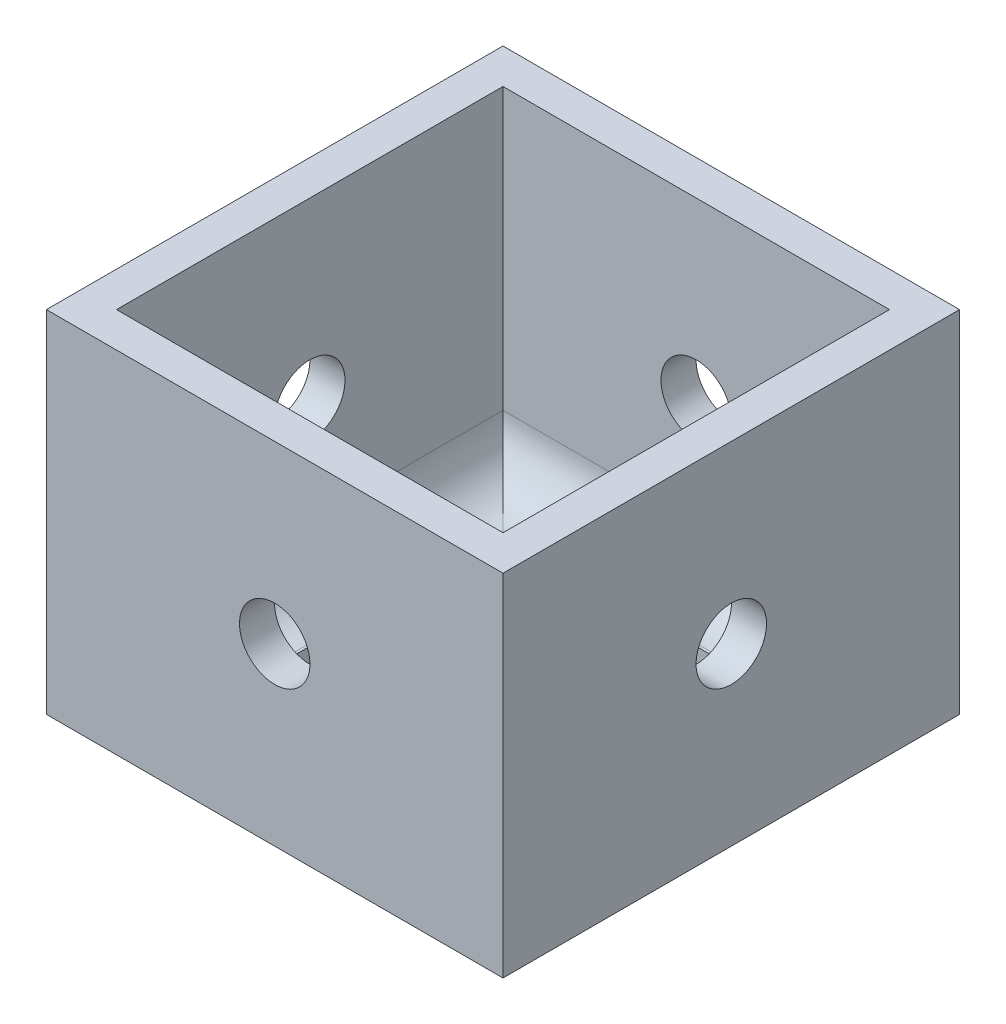
ISO-10303-21;
HEADER;
FILE_DESCRIPTION(('STEP AP214'),'2;1');
FILE_NAME('part.step','',(''),(''),'','','');
FILE_SCHEMA(('AUTOMOTIVE_DESIGN { 1 0 10303 214 1 1 1 1 }'));
ENDSEC;
DATA;
#1=APPLICATION_CONTEXT('core data for automotive mechanical design processes');
#2=APPLICATION_PROTOCOL_DEFINITION('international standard','automotive_design',2000,#1);
#3=PRODUCT_CONTEXT('',#1,'mechanical');
#4=PRODUCT('Part','Part','',(#3));
#5=PRODUCT_RELATED_PRODUCT_CATEGORY('part','',(#4));
#6=PRODUCT_DEFINITION_FORMATION('','',#4);
#7=PRODUCT_DEFINITION_CONTEXT('part definition',#1,'design');
#8=PRODUCT_DEFINITION('design','',#6,#7);
#9=PRODUCT_DEFINITION_SHAPE('','',#8);
#10=(LENGTH_UNIT() NAMED_UNIT(*) SI_UNIT(.MILLI.,.METRE.));
#11=(NAMED_UNIT(*) PLANE_ANGLE_UNIT() SI_UNIT($,.RADIAN.));
#12=(NAMED_UNIT(*) SI_UNIT($,.STERADIAN.) SOLID_ANGLE_UNIT());
#13=UNCERTAINTY_MEASURE_WITH_UNIT(LENGTH_MEASURE(1.E-05),#10,'distance_accuracy_value','');
#14=(GEOMETRIC_REPRESENTATION_CONTEXT(3) GLOBAL_UNCERTAINTY_ASSIGNED_CONTEXT((#13)) GLOBAL_UNIT_ASSIGNED_CONTEXT((#10,
#11,#12)) REPRESENTATION_CONTEXT('',''));
#15=CARTESIAN_POINT('',(0.,0.,0.));
#16=DIRECTION('',(0.,0.,1.));
#17=DIRECTION('',(1.,0.,0.));
#18=AXIS2_PLACEMENT_3D('',#15,#16,#17);
#19=CARTESIAN_POINT('',(0.,25.4,0.));
#20=DIRECTION('',(-1.,0.,0.));
#21=DIRECTION('',(0.,0.,1.));
#22=AXIS2_PLACEMENT_3D('',#19,#20,#21);
#23=PLANE('',#22);
#24=CARTESIAN_POINT('',(0.,12.7,-13.9999999999999));
#25=DIRECTION('',(-1.,0.,0.));
#26=DIRECTION('',(0.,0.,1.));
#27=AXIS2_PLACEMENT_3D('',#24,#25,#26);
#28=CIRCLE('',#27,2.55269999999999);
#29=CARTESIAN_POINT('',(0.,12.7,-11.4472999999999));
#30=VERTEX_POINT('',#29);
#31=EDGE_CURVE('E224',#30,#30,#28,.T.);
#32=ORIENTED_EDGE('',*,*,#31,.T.);
#33=EDGE_LOOP('',(#32));
#34=FACE_BOUND('',#33,.T.);
#35=DIRECTION('',(0.,-1.,0.));
#36=VECTOR('',#35,1.);
#37=CARTESIAN_POINT('',(0.,25.4,0.));
#38=LINE('',#37,#36);
#39=CARTESIAN_POINT('',(0.,25.4,0.));
#40=VERTEX_POINT('',#39);
#41=CARTESIAN_POINT('',(0.,5.08,0.));
#42=VERTEX_POINT('',#41);
#43=EDGE_CURVE('E265',#40,#42,#38,.T.);
#44=ORIENTED_EDGE('',*,*,#43,.T.);
#45=DIRECTION('',(0.,0.,1.));
#46=VECTOR('',#45,1.);
#47=CARTESIAN_POINT('',(0.,5.08,-28.));
#48=LINE('',#47,#46);
#49=CARTESIAN_POINT('',(0.,5.08,-28.));
#50=VERTEX_POINT('',#49);
#51=EDGE_CURVE('E339',#42,#50,#48,.F.);
#52=ORIENTED_EDGE('',*,*,#51,.T.);
#53=DIRECTION('',(0.,-1.,0.));
#54=VECTOR('',#53,1.);
#55=CARTESIAN_POINT('',(0.,25.4,-28.));
#56=LINE('',#55,#54);
#57=CARTESIAN_POINT('',(0.,25.4,-28.));
#58=VERTEX_POINT('',#57);
#59=EDGE_CURVE('E264',#58,#50,#56,.T.);
#60=ORIENTED_EDGE('',*,*,#59,.F.);
#61=DIRECTION('',(0.,0.,-1.));
#62=VECTOR('',#61,1.);
#63=CARTESIAN_POINT('',(0.,25.4,0.));
#64=LINE('',#63,#62);
#65=EDGE_CURVE('E249',#40,#58,#64,.T.);
#66=ORIENTED_EDGE('',*,*,#65,.F.);
#67=EDGE_LOOP('',(#44,#52,#60,#66));
#68=FACE_BOUND('',#67,.T.);
#69=ADVANCED_FACE('F63',(#34,#68),#23,.F.);
#70=CARTESIAN_POINT('',(0.,25.4,0.));
#71=DIRECTION('',(0.,0.,-1.));
#72=DIRECTION('',(-1.,0.,0.));
#73=AXIS2_PLACEMENT_3D('',#70,#71,#72);
#74=PLANE('',#73);
#75=CARTESIAN_POINT('',(14.,12.7,0.));
#76=DIRECTION('',(0.,0.,-1.));
#77=DIRECTION('',(-1.,0.,0.));
#78=AXIS2_PLACEMENT_3D('',#75,#76,#77);
#79=CIRCLE('',#78,2.55269999999999);
#80=CARTESIAN_POINT('',(11.4473,12.7,0.));
#81=VERTEX_POINT('',#80);
#82=EDGE_CURVE('E245',#81,#81,#79,.T.);
#83=ORIENTED_EDGE('',*,*,#82,.F.);
#84=EDGE_LOOP('',(#83));
#85=FACE_BOUND('',#84,.T.);
#86=DIRECTION('',(0.,-1.,0.));
#87=VECTOR('',#86,1.);
#88=CARTESIAN_POINT('',(28.,25.4,0.));
#89=LINE('',#88,#87);
#90=CARTESIAN_POINT('',(28.,25.4,0.));
#91=VERTEX_POINT('',#90);
#92=CARTESIAN_POINT('',(28.,5.08,0.));
#93=VERTEX_POINT('',#92);
#94=EDGE_CURVE('E269',#91,#93,#89,.T.);
#95=ORIENTED_EDGE('',*,*,#94,.T.);
#96=DIRECTION('',(1.,0.,0.));
#97=VECTOR('',#96,1.);
#98=CARTESIAN_POINT('',(0.,5.08,0.));
#99=LINE('',#98,#97);
#100=EDGE_CURVE('E73',#93,#42,#99,.F.);
#101=ORIENTED_EDGE('',*,*,#100,.T.);
#102=ORIENTED_EDGE('',*,*,#43,.F.);
#103=DIRECTION('',(1.,0.,0.));
#104=VECTOR('',#103,1.);
#105=CARTESIAN_POINT('',(0.,25.4,0.));
#106=LINE('',#105,#104);
#107=EDGE_CURVE('E261',#40,#91,#106,.T.);
#108=ORIENTED_EDGE('',*,*,#107,.T.);
#109=EDGE_LOOP('',(#95,#101,#102,#108));
#110=FACE_BOUND('',#109,.T.);
#111=ADVANCED_FACE('F389',(#85,#110),#74,.T.);
#112=CARTESIAN_POINT('',(28.,25.4,0.));
#113=DIRECTION('',(-1.,0.,0.));
#114=DIRECTION('',(0.,0.,1.));
#115=AXIS2_PLACEMENT_3D('',#112,#113,#114);
#116=PLANE('',#115);
#117=CARTESIAN_POINT('',(28.,12.7,-14.));
#118=DIRECTION('',(-1.,0.,0.));
#119=DIRECTION('',(0.,0.,1.));
#120=AXIS2_PLACEMENT_3D('',#117,#118,#119);
#121=CIRCLE('',#120,2.55269999999999);
#122=CARTESIAN_POINT('',(28.,12.7,-11.4473000000001));
#123=VERTEX_POINT('',#122);
#124=EDGE_CURVE('E237',#123,#123,#121,.T.);
#125=ORIENTED_EDGE('',*,*,#124,.F.);
#126=EDGE_LOOP('',(#125));
#127=FACE_BOUND('',#126,.T.);
#128=DIRECTION('',(0.,-1.,0.));
#129=VECTOR('',#128,1.);
#130=CARTESIAN_POINT('',(28.,25.4,-28.));
#131=LINE('',#130,#129);
#132=CARTESIAN_POINT('',(28.,25.4,-28.));
#133=VERTEX_POINT('',#132);
#134=CARTESIAN_POINT('',(28.,5.08,-28.));
#135=VERTEX_POINT('',#134);
#136=EDGE_CURVE('E272',#133,#135,#131,.T.);
#137=ORIENTED_EDGE('',*,*,#136,.T.);
#138=DIRECTION('',(0.,0.,-1.));
#139=VECTOR('',#138,1.);
#140=CARTESIAN_POINT('',(28.,5.08,0.));
#141=LINE('',#140,#139);
#142=EDGE_CURVE('E12',#135,#93,#141,.F.);
#143=ORIENTED_EDGE('',*,*,#142,.T.);
#144=ORIENTED_EDGE('',*,*,#94,.F.);
#145=DIRECTION('',(0.,0.,-1.));
#146=VECTOR('',#145,1.);
#147=CARTESIAN_POINT('',(28.,25.4,0.));
#148=LINE('',#147,#146);
#149=EDGE_CURVE('E257',#91,#133,#148,.T.);
#150=ORIENTED_EDGE('',*,*,#149,.T.);
#151=EDGE_LOOP('',(#137,#143,#144,#150));
#152=FACE_BOUND('',#151,.T.);
#153=ADVANCED_FACE('F395',(#127,#152),#116,.T.);
#154=CARTESIAN_POINT('',(0.,25.4,-28.));
#155=DIRECTION('',(0.,0.,-1.));
#156=DIRECTION('',(-1.,0.,0.));
#157=AXIS2_PLACEMENT_3D('',#154,#155,#156);
#158=PLANE('',#157);
#159=CARTESIAN_POINT('',(14.,12.7,-28.));
#160=DIRECTION('',(0.,0.,-1.));
#161=DIRECTION('',(-1.,0.,0.));
#162=AXIS2_PLACEMENT_3D('',#159,#160,#161);
#163=CIRCLE('',#162,2.55269999999999);
#164=CARTESIAN_POINT('',(11.4473,12.7,-28.));
#165=VERTEX_POINT('',#164);
#166=EDGE_CURVE('E232',#165,#165,#163,.T.);
#167=ORIENTED_EDGE('',*,*,#166,.T.);
#168=EDGE_LOOP('',(#167));
#169=FACE_BOUND('',#168,.T.);
#170=ORIENTED_EDGE('',*,*,#59,.T.);
#171=DIRECTION('',(-1.,0.,0.));
#172=VECTOR('',#171,1.);
#173=CARTESIAN_POINT('',(28.,5.08,-28.));
#174=LINE('',#173,#172);
#175=EDGE_CURVE('E335',#50,#135,#174,.F.);
#176=ORIENTED_EDGE('',*,*,#175,.T.);
#177=ORIENTED_EDGE('',*,*,#136,.F.);
#178=DIRECTION('',(1.,0.,0.));
#179=VECTOR('',#178,1.);
#180=CARTESIAN_POINT('',(0.,25.4,-28.));
#181=LINE('',#180,#179);
#182=EDGE_CURVE('E253',#58,#133,#181,.T.);
#183=ORIENTED_EDGE('',*,*,#182,.F.);
#184=EDGE_LOOP('',(#170,#176,#177,#183));
#185=FACE_BOUND('',#184,.T.);
#186=ADVANCED_FACE('F372',(#169,#185),#158,.F.);
#187=CARTESIAN_POINT('',(-2.54,25.4,0.));
#188=DIRECTION('',(-1.,0.,0.));
#189=DIRECTION('',(0.,0.,1.));
#190=AXIS2_PLACEMENT_3D('',#187,#188,#189);
#191=PLANE('',#190);
#192=CARTESIAN_POINT('',(-2.54,12.7,-13.9999999999998));
#193=DIRECTION('',(-1.,0.,0.));
#194=DIRECTION('',(0.,0.,1.));
#195=AXIS2_PLACEMENT_3D('',#192,#193,#194);
#196=CIRCLE('',#195,2.55269999999999);
#197=CARTESIAN_POINT('',(-2.53999999999998,12.7,-11.4472999999998));
#198=VERTEX_POINT('',#197);
#199=EDGE_CURVE('E187',#198,#198,#196,.T.);
#200=ORIENTED_EDGE('',*,*,#199,.F.);
#201=EDGE_LOOP('',(#200));
#202=FACE_BOUND('',#201,.T.);
#203=DIRECTION('',(0.,0.,-1.));
#204=VECTOR('',#203,1.);
#205=CARTESIAN_POINT('',(-2.54,0.,0.));
#206=LINE('',#205,#204);
#207=CARTESIAN_POINT('',(-2.54,0.,2.54));
#208=VERTEX_POINT('',#207);
#209=CARTESIAN_POINT('',(-2.54,0.,-30.54));
#210=VERTEX_POINT('',#209);
#211=EDGE_CURVE('E268',#208,#210,#206,.T.);
#212=ORIENTED_EDGE('',*,*,#211,.F.);
#213=DIRECTION('',(0.,-1.,0.));
#214=VECTOR('',#213,1.);
#215=CARTESIAN_POINT('',(-2.54,25.4,2.54));
#216=LINE('',#215,#214);
#217=CARTESIAN_POINT('',(-2.54,25.4,2.54));
#218=VERTEX_POINT('',#217);
#219=EDGE_CURVE('E307',#218,#208,#216,.T.);
#220=ORIENTED_EDGE('',*,*,#219,.F.);
#221=DIRECTION('',(0.,0.,-1.));
#222=VECTOR('',#221,1.);
#223=CARTESIAN_POINT('',(-2.54,25.4,0.));
#224=LINE('',#223,#222);
#225=CARTESIAN_POINT('',(-2.54,25.4,-30.54));
#226=VERTEX_POINT('',#225);
#227=EDGE_CURVE('E278',#218,#226,#224,.T.);
#228=ORIENTED_EDGE('',*,*,#227,.T.);
#229=DIRECTION('',(0.,-1.,0.));
#230=VECTOR('',#229,1.);
#231=CARTESIAN_POINT('',(-2.54,25.4,-30.54));
#232=LINE('',#231,#230);
#233=EDGE_CURVE('E293',#226,#210,#232,.T.);
#234=ORIENTED_EDGE('',*,*,#233,.T.);
#235=EDGE_LOOP('',(#212,#220,#228,#234));
#236=FACE_BOUND('',#235,.T.);
#237=ADVANCED_FACE('F415',(#202,#236),#191,.T.);
#238=CARTESIAN_POINT('',(0.,25.4,2.54));
#239=DIRECTION('',(0.,0.,-1.));
#240=DIRECTION('',(-1.,0.,0.));
#241=AXIS2_PLACEMENT_3D('',#238,#239,#240);
#242=PLANE('',#241);
#243=CARTESIAN_POINT('',(14.,12.7,2.54));
#244=DIRECTION('',(0.,0.,1.));
#245=DIRECTION('',(1.,0.,0.));
#246=AXIS2_PLACEMENT_3D('',#243,#244,#245);
#247=CIRCLE('',#246,2.55269999999999);
#248=CARTESIAN_POINT('',(16.5527,12.7,2.54));
#249=VERTEX_POINT('',#248);
#250=EDGE_CURVE('E241',#249,#249,#247,.T.);
#251=ORIENTED_EDGE('',*,*,#250,.F.);
#252=EDGE_LOOP('',(#251));
#253=FACE_BOUND('',#252,.T.);
#254=DIRECTION('',(1.,0.,0.));
#255=VECTOR('',#254,1.);
#256=CARTESIAN_POINT('',(0.,0.,2.54));
#257=LINE('',#256,#255);
#258=CARTESIAN_POINT('',(30.54,0.,2.54));
#259=VERTEX_POINT('',#258);
#260=EDGE_CURVE('E283',#208,#259,#257,.T.);
#261=ORIENTED_EDGE('',*,*,#260,.T.);
#262=DIRECTION('',(0.,-1.,0.));
#263=VECTOR('',#262,1.);
#264=CARTESIAN_POINT('',(30.54,25.4,2.54));
#265=LINE('',#264,#263);
#266=CARTESIAN_POINT('',(30.54,25.4,2.54));
#267=VERTEX_POINT('',#266);
#268=EDGE_CURVE('E311',#267,#259,#265,.T.);
#269=ORIENTED_EDGE('',*,*,#268,.F.);
#270=DIRECTION('',(1.,0.,0.));
#271=VECTOR('',#270,1.);
#272=CARTESIAN_POINT('',(0.,25.4,2.54));
#273=LINE('',#272,#271);
#274=EDGE_CURVE('E290',#218,#267,#273,.T.);
#275=ORIENTED_EDGE('',*,*,#274,.F.);
#276=ORIENTED_EDGE('',*,*,#219,.T.);
#277=EDGE_LOOP('',(#261,#269,#275,#276));
#278=FACE_BOUND('',#277,.T.);
#279=ADVANCED_FACE('F411',(#253,#278),#242,.F.);
#280=CARTESIAN_POINT('',(30.54,25.4,0.));
#281=DIRECTION('',(-1.,0.,0.));
#282=DIRECTION('',(0.,0.,1.));
#283=AXIS2_PLACEMENT_3D('',#280,#281,#282);
#284=PLANE('',#283);
#285=CARTESIAN_POINT('',(30.54,12.7,-14.0000000000001));
#286=DIRECTION('',(1.,0.,0.));
#287=DIRECTION('',(0.,0.,-1.));
#288=AXIS2_PLACEMENT_3D('',#285,#286,#287);
#289=CIRCLE('',#288,2.55269999999999);
#290=CARTESIAN_POINT('',(30.54,12.7,-16.5527));
#291=VERTEX_POINT('',#290);
#292=EDGE_CURVE('E233',#291,#291,#289,.T.);
#293=ORIENTED_EDGE('',*,*,#292,.F.);
#294=EDGE_LOOP('',(#293));
#295=FACE_BOUND('',#294,.T.);
#296=DIRECTION('',(0.,0.,-1.));
#297=VECTOR('',#296,1.);
#298=CARTESIAN_POINT('',(30.54,0.,0.));
#299=LINE('',#298,#297);
#300=CARTESIAN_POINT('',(30.54,0.,-30.54));
#301=VERTEX_POINT('',#300);
#302=EDGE_CURVE('E301',#259,#301,#299,.T.);
#303=ORIENTED_EDGE('',*,*,#302,.T.);
#304=DIRECTION('',(0.,-1.,0.));
#305=VECTOR('',#304,1.);
#306=CARTESIAN_POINT('',(30.54,25.4,-30.54));
#307=LINE('',#306,#305);
#308=CARTESIAN_POINT('',(30.54,25.4,-30.54));
#309=VERTEX_POINT('',#308);
#310=EDGE_CURVE('E315',#309,#301,#307,.T.);
#311=ORIENTED_EDGE('',*,*,#310,.F.);
#312=DIRECTION('',(0.,0.,-1.));
#313=VECTOR('',#312,1.);
#314=CARTESIAN_POINT('',(30.54,25.4,0.));
#315=LINE('',#314,#313);
#316=EDGE_CURVE('E287',#267,#309,#315,.T.);
#317=ORIENTED_EDGE('',*,*,#316,.F.);
#318=ORIENTED_EDGE('',*,*,#268,.T.);
#319=EDGE_LOOP('',(#303,#311,#317,#318));
#320=FACE_BOUND('',#319,.T.);
#321=ADVANCED_FACE('F414',(#295,#320),#284,.F.);
#322=CARTESIAN_POINT('',(0.,25.4,-30.54));
#323=DIRECTION('',(0.,0.,-1.));
#324=DIRECTION('',(-1.,0.,0.));
#325=AXIS2_PLACEMENT_3D('',#322,#323,#324);
#326=PLANE('',#325);
#327=CARTESIAN_POINT('',(14.,12.7,-30.54));
#328=DIRECTION('',(0.,0.,-1.));
#329=DIRECTION('',(-1.,0.,0.));
#330=AXIS2_PLACEMENT_3D('',#327,#328,#329);
#331=CIRCLE('',#330,2.55269999999999);
#332=CARTESIAN_POINT('',(11.4473,12.7,-30.54));
#333=VERTEX_POINT('',#332);
#334=EDGE_CURVE('E228',#333,#333,#331,.T.);
#335=ORIENTED_EDGE('',*,*,#334,.F.);
#336=EDGE_LOOP('',(#335));
#337=FACE_BOUND('',#336,.T.);
#338=DIRECTION('',(1.,0.,0.));
#339=VECTOR('',#338,1.);
#340=CARTESIAN_POINT('',(0.,0.,-30.54));
#341=LINE('',#340,#339);
#342=EDGE_CURVE('E297',#210,#301,#341,.T.);
#343=ORIENTED_EDGE('',*,*,#342,.F.);
#344=ORIENTED_EDGE('',*,*,#233,.F.);
#345=DIRECTION('',(1.,0.,0.));
#346=VECTOR('',#345,1.);
#347=CARTESIAN_POINT('',(0.,25.4,-30.54));
#348=LINE('',#347,#346);
#349=EDGE_CURVE('E282',#226,#309,#348,.T.);
#350=ORIENTED_EDGE('',*,*,#349,.T.);
#351=ORIENTED_EDGE('',*,*,#310,.T.);
#352=EDGE_LOOP('',(#343,#344,#350,#351));
#353=FACE_BOUND('',#352,.T.);
#354=ADVANCED_FACE('F405',(#337,#353),#326,.T.);
#355=CARTESIAN_POINT('',(0.,25.4,0.));
#356=DIRECTION('',(0.,-1.,0.));
#357=DIRECTION('',(0.,0.,-1.));
#358=AXIS2_PLACEMENT_3D('',#355,#356,#357);
#359=PLANE('',#358);
#360=ORIENTED_EDGE('',*,*,#107,.F.);
#361=ORIENTED_EDGE('',*,*,#65,.T.);
#362=ORIENTED_EDGE('',*,*,#182,.T.);
#363=ORIENTED_EDGE('',*,*,#149,.F.);
#364=EDGE_LOOP('',(#360,#361,#362,#363));
#365=FACE_BOUND('',#364,.T.);
#366=ORIENTED_EDGE('',*,*,#227,.F.);
#367=ORIENTED_EDGE('',*,*,#274,.T.);
#368=ORIENTED_EDGE('',*,*,#316,.T.);
#369=ORIENTED_EDGE('',*,*,#349,.F.);
#370=EDGE_LOOP('',(#366,#367,#368,#369));
#371=FACE_BOUND('',#370,.T.);
#372=ADVANCED_FACE('F401',(#365,#371),#359,.F.);
#373=CARTESIAN_POINT('',(0.,0.,0.));
#374=DIRECTION('',(0.,-1.,0.));
#375=DIRECTION('',(0.,0.,-1.));
#376=AXIS2_PLACEMENT_3D('',#373,#374,#375);
#377=PLANE('',#376);
#378=ORIENTED_EDGE('',*,*,#211,.T.);
#379=ORIENTED_EDGE('',*,*,#342,.T.);
#380=ORIENTED_EDGE('',*,*,#302,.F.);
#381=ORIENTED_EDGE('',*,*,#260,.F.);
#382=EDGE_LOOP('',(#378,#379,#380,#381));
#383=FACE_BOUND('',#382,.T.);
#384=DIRECTION('',(-1.,0.,0.));
#385=VECTOR('',#384,1.);
#386=CARTESIAN_POINT('',(4.,0.,-24.));
#387=LINE('',#386,#385);
#388=CARTESIAN_POINT('',(24.,0.,-24.));
#389=VERTEX_POINT('',#388);
#390=CARTESIAN_POINT('',(4.,0.,-24.));
#391=VERTEX_POINT('',#390);
#392=EDGE_CURVE('E179',#389,#391,#387,.T.);
#393=ORIENTED_EDGE('',*,*,#392,.T.);
#394=DIRECTION('',(0.,0.,1.));
#395=VECTOR('',#394,1.);
#396=CARTESIAN_POINT('',(4.,0.,-4.));
#397=LINE('',#396,#395);
#398=CARTESIAN_POINT('',(4.,0.,-4.));
#399=VERTEX_POINT('',#398);
#400=EDGE_CURVE('E202',#391,#399,#397,.T.);
#401=ORIENTED_EDGE('',*,*,#400,.T.);
#402=DIRECTION('',(1.,0.,0.));
#403=VECTOR('',#402,1.);
#404=CARTESIAN_POINT('',(4.,0.,-4.));
#405=LINE('',#404,#403);
#406=CARTESIAN_POINT('',(24.,0.,-4.));
#407=VERTEX_POINT('',#406);
#408=EDGE_CURVE('E185',#399,#407,#405,.T.);
#409=ORIENTED_EDGE('',*,*,#408,.T.);
#410=DIRECTION('',(0.,0.,-1.));
#411=VECTOR('',#410,1.);
#412=CARTESIAN_POINT('',(24.,0.,-4.));
#413=LINE('',#412,#411);
#414=EDGE_CURVE('E207',#407,#389,#413,.T.);
#415=ORIENTED_EDGE('',*,*,#414,.T.);
#416=EDGE_LOOP('',(#393,#401,#409,#415));
#417=FACE_BOUND('',#416,.T.);
#418=ADVANCED_FACE('F404',(#383,#417),#377,.T.);
#419=CARTESIAN_POINT('',(14.,12.7,2.54));
#420=DIRECTION('',(0.,0.,1.));
#421=DIRECTION('',(1.,0.,0.));
#422=AXIS2_PLACEMENT_3D('',#419,#420,#421);
#423=CYLINDRICAL_SURFACE('',#422,2.55269999999999);
#424=ORIENTED_EDGE('',*,*,#82,.T.);
#425=EDGE_LOOP('',(#424));
#426=FACE_BOUND('',#425,.T.);
#427=ORIENTED_EDGE('',*,*,#250,.T.);
#428=EDGE_LOOP('',(#427));
#429=FACE_BOUND('',#428,.T.);
#430=ADVANCED_FACE('F409',(#426,#429),#423,.F.);
#431=CARTESIAN_POINT('',(30.54,12.7,-14.0000000000001));
#432=DIRECTION('',(1.,0.,0.));
#433=DIRECTION('',(0.,0.,-1.));
#434=AXIS2_PLACEMENT_3D('',#431,#432,#433);
#435=CYLINDRICAL_SURFACE('',#434,2.55269999999999);
#436=ORIENTED_EDGE('',*,*,#124,.T.);
#437=EDGE_LOOP('',(#436));
#438=FACE_BOUND('',#437,.T.);
#439=ORIENTED_EDGE('',*,*,#292,.T.);
#440=EDGE_LOOP('',(#439));
#441=FACE_BOUND('',#440,.T.);
#442=ADVANCED_FACE('F539',(#438,#441),#435,.F.);
#443=CARTESIAN_POINT('',(14.,12.7,-30.54));
#444=DIRECTION('',(0.,0.,-1.));
#445=DIRECTION('',(-1.,0.,0.));
#446=AXIS2_PLACEMENT_3D('',#443,#444,#445);
#447=CYLINDRICAL_SURFACE('',#446,2.55269999999999);
#448=ORIENTED_EDGE('',*,*,#334,.T.);
#449=EDGE_LOOP('',(#448));
#450=FACE_BOUND('',#449,.T.);
#451=ORIENTED_EDGE('',*,*,#166,.F.);
#452=EDGE_LOOP('',(#451));
#453=FACE_BOUND('',#452,.T.);
#454=ADVANCED_FACE('F385',(#450,#453),#447,.F.);
#455=CARTESIAN_POINT('',(-2.54,12.7,-13.9999999999998));
#456=DIRECTION('',(-1.,0.,0.));
#457=DIRECTION('',(0.,0.,1.));
#458=AXIS2_PLACEMENT_3D('',#455,#456,#457);
#459=CYLINDRICAL_SURFACE('',#458,2.55269999999999);
#460=ORIENTED_EDGE('',*,*,#199,.T.);
#461=EDGE_LOOP('',(#460));
#462=FACE_BOUND('',#461,.T.);
#463=ORIENTED_EDGE('',*,*,#31,.F.);
#464=EDGE_LOOP('',(#463));
#465=FACE_BOUND('',#464,.T.);
#466=ADVANCED_FACE('F378',(#462,#465),#459,.F.);
#467=CARTESIAN_POINT('',(0.,1.27,0.));
#468=DIRECTION('',(0.,-1.,0.));
#469=DIRECTION('',(0.,0.,-1.));
#470=AXIS2_PLACEMENT_3D('',#467,#468,#469);
#471=PLANE('',#470);
#472=DIRECTION('',(0.,0.,-1.));
#473=VECTOR('',#472,1.);
#474=CARTESIAN_POINT('',(24.19,1.27,0.));
#475=LINE('',#474,#473);
#476=CARTESIAN_POINT('',(24.19,1.27,-3.81));
#477=VERTEX_POINT('',#476);
#478=CARTESIAN_POINT('',(24.19,1.27,-24.19));
#479=VERTEX_POINT('',#478);
#480=EDGE_CURVE('E310',#477,#479,#475,.T.);
#481=ORIENTED_EDGE('',*,*,#480,.T.);
#482=DIRECTION('',(-1.,0.,0.));
#483=VECTOR('',#482,1.);
#484=CARTESIAN_POINT('',(0.,1.27,-24.19));
#485=LINE('',#484,#483);
#486=CARTESIAN_POINT('',(3.81,1.27,-24.19));
#487=VERTEX_POINT('',#486);
#488=EDGE_CURVE('E331',#479,#487,#485,.T.);
#489=ORIENTED_EDGE('',*,*,#488,.T.);
#490=DIRECTION('',(0.,0.,1.));
#491=VECTOR('',#490,1.);
#492=CARTESIAN_POINT('',(3.81,1.27,0.));
#493=LINE('',#492,#491);
#494=CARTESIAN_POINT('',(3.81,1.27,-3.81));
#495=VERTEX_POINT('',#494);
#496=EDGE_CURVE('E328',#487,#495,#493,.T.);
#497=ORIENTED_EDGE('',*,*,#496,.T.);
#498=DIRECTION('',(1.,0.,0.));
#499=VECTOR('',#498,1.);
#500=CARTESIAN_POINT('',(0.,1.27,-3.81));
#501=LINE('',#500,#499);
#502=EDGE_CURVE('E325',#495,#477,#501,.T.);
#503=ORIENTED_EDGE('',*,*,#502,.T.);
#504=EDGE_LOOP('',(#481,#489,#497,#503));
#505=FACE_BOUND('',#504,.T.);
#506=DIRECTION('',(0.,0.,1.));
#507=VECTOR('',#506,1.);
#508=CARTESIAN_POINT('',(4.,1.27,-4.));
#509=LINE('',#508,#507);
#510=CARTESIAN_POINT('',(4.,1.27,-24.));
#511=VERTEX_POINT('',#510);
#512=CARTESIAN_POINT('',(4.,1.27,-4.));
#513=VERTEX_POINT('',#512);
#514=EDGE_CURVE('E167',#511,#513,#509,.T.);
#515=ORIENTED_EDGE('',*,*,#514,.F.);
#516=DIRECTION('',(-1.,0.,0.));
#517=VECTOR('',#516,1.);
#518=CARTESIAN_POINT('',(4.,1.27,-24.));
#519=LINE('',#518,#517);
#520=CARTESIAN_POINT('',(24.,1.27,-24.));
#521=VERTEX_POINT('',#520);
#522=EDGE_CURVE('E197',#521,#511,#519,.T.);
#523=ORIENTED_EDGE('',*,*,#522,.F.);
#524=DIRECTION('',(0.,0.,-1.));
#525=VECTOR('',#524,1.);
#526=CARTESIAN_POINT('',(24.,1.27,-4.));
#527=LINE('',#526,#525);
#528=CARTESIAN_POINT('',(24.,1.27,-4.));
#529=VERTEX_POINT('',#528);
#530=EDGE_CURVE('E193',#529,#521,#527,.T.);
#531=ORIENTED_EDGE('',*,*,#530,.F.);
#532=DIRECTION('',(1.,0.,0.));
#533=VECTOR('',#532,1.);
#534=CARTESIAN_POINT('',(4.,1.27,-4.));
#535=LINE('',#534,#533);
#536=EDGE_CURVE('E178',#513,#529,#535,.T.);
#537=ORIENTED_EDGE('',*,*,#536,.F.);
#538=EDGE_LOOP('',(#515,#523,#531,#537));
#539=FACE_BOUND('',#538,.T.);
#540=ADVANCED_FACE('F191',(#505,#539),#471,.F.);
#541=CARTESIAN_POINT('',(4.,1.27,-4.));
#542=DIRECTION('',(1.,0.,0.));
#543=DIRECTION('',(0.,0.,-1.));
#544=AXIS2_PLACEMENT_3D('',#541,#542,#543);
#545=PLANE('',#544);
#546=ORIENTED_EDGE('',*,*,#400,.F.);
#547=DIRECTION('',(0.,-1.,0.));
#548=VECTOR('',#547,1.);
#549=CARTESIAN_POINT('',(4.,1.27,-24.));
#550=LINE('',#549,#548);
#551=EDGE_CURVE('E173',#511,#391,#550,.T.);
#552=ORIENTED_EDGE('',*,*,#551,.F.);
#553=ORIENTED_EDGE('',*,*,#514,.T.);
#554=DIRECTION('',(0.,-1.,0.));
#555=VECTOR('',#554,1.);
#556=CARTESIAN_POINT('',(4.,1.27,-4.));
#557=LINE('',#556,#555);
#558=EDGE_CURVE('E170',#513,#399,#557,.T.);
#559=ORIENTED_EDGE('',*,*,#558,.T.);
#560=EDGE_LOOP('',(#546,#552,#553,#559));
#561=FACE_BOUND('',#560,.T.);
#562=ADVANCED_FACE('F169',(#561),#545,.T.);
#563=CARTESIAN_POINT('',(4.,1.27,-4.));
#564=DIRECTION('',(0.,0.,-1.));
#565=DIRECTION('',(-1.,0.,0.));
#566=AXIS2_PLACEMENT_3D('',#563,#564,#565);
#567=PLANE('',#566);
#568=ORIENTED_EDGE('',*,*,#408,.F.);
#569=ORIENTED_EDGE('',*,*,#558,.F.);
#570=ORIENTED_EDGE('',*,*,#536,.T.);
#571=DIRECTION('',(0.,-1.,0.));
#572=VECTOR('',#571,1.);
#573=CARTESIAN_POINT('',(24.,1.27,-4.));
#574=LINE('',#573,#572);
#575=EDGE_CURVE('E188',#529,#407,#574,.T.);
#576=ORIENTED_EDGE('',*,*,#575,.T.);
#577=EDGE_LOOP('',(#568,#569,#570,#576));
#578=FACE_BOUND('',#577,.T.);
#579=ADVANCED_FACE('F182',(#578),#567,.T.);
#580=CARTESIAN_POINT('',(24.,1.27,-4.));
#581=DIRECTION('',(-1.,0.,0.));
#582=DIRECTION('',(0.,0.,1.));
#583=AXIS2_PLACEMENT_3D('',#580,#581,#582);
#584=PLANE('',#583);
#585=ORIENTED_EDGE('',*,*,#414,.F.);
#586=ORIENTED_EDGE('',*,*,#575,.F.);
#587=ORIENTED_EDGE('',*,*,#530,.T.);
#588=DIRECTION('',(0.,-1.,0.));
#589=VECTOR('',#588,1.);
#590=CARTESIAN_POINT('',(24.,1.27,-24.));
#591=LINE('',#590,#589);
#592=EDGE_CURVE('E216',#521,#389,#591,.T.);
#593=ORIENTED_EDGE('',*,*,#592,.T.);
#594=EDGE_LOOP('',(#585,#586,#587,#593));
#595=FACE_BOUND('',#594,.T.);
#596=ADVANCED_FACE('F437',(#595),#584,.T.);
#597=CARTESIAN_POINT('',(4.,1.27,-24.));
#598=DIRECTION('',(0.,0.,1.));
#599=DIRECTION('',(1.,0.,0.));
#600=AXIS2_PLACEMENT_3D('',#597,#598,#599);
#601=PLANE('',#600);
#602=ORIENTED_EDGE('',*,*,#392,.F.);
#603=ORIENTED_EDGE('',*,*,#592,.F.);
#604=ORIENTED_EDGE('',*,*,#522,.T.);
#605=ORIENTED_EDGE('',*,*,#551,.T.);
#606=EDGE_LOOP('',(#602,#603,#604,#605));
#607=FACE_BOUND('',#606,.T.);
#608=ADVANCED_FACE('F433',(#607),#601,.T.);
#609=CARTESIAN_POINT('',(0.,5.08,-3.81));
#610=DIRECTION('',(1.,0.,0.));
#611=DIRECTION('',(0.,0.,-1.));
#612=AXIS2_PLACEMENT_3D('',#609,#610,#611);
#613=CYLINDRICAL_SURFACE('',#612,3.81);
#614=CARTESIAN_POINT('',(3.81,5.08,-3.81));
#615=DIRECTION('',(-0.707106781186547,0.,-0.707106781186547));
#616=DIRECTION('',(0.707106781186547,0.,-0.707106781186547));
#617=AXIS2_PLACEMENT_3D('',#614,#615,#616);
#618=ELLIPSE('',#617,5.38815367264149,3.81);
#619=EDGE_CURVE('E349',#42,#495,#618,.F.);
#620=ORIENTED_EDGE('',*,*,#619,.F.);
#621=ORIENTED_EDGE('',*,*,#100,.F.);
#622=CARTESIAN_POINT('',(24.19,5.08,-3.81));
#623=DIRECTION('',(0.707106781186547,0.,-0.707106781186547));
#624=DIRECTION('',(0.707106781186547,0.,0.707106781186547));
#625=AXIS2_PLACEMENT_3D('',#622,#623,#624);
#626=ELLIPSE('',#625,5.38815367264149,3.81);
#627=EDGE_CURVE('E67',#477,#93,#626,.F.);
#628=ORIENTED_EDGE('',*,*,#627,.F.);
#629=ORIENTED_EDGE('',*,*,#502,.F.);
#630=EDGE_LOOP('',(#620,#621,#628,#629));
#631=FACE_BOUND('',#630,.T.);
#632=ADVANCED_FACE('F65',(#631),#613,.F.);
#633=CARTESIAN_POINT('',(24.19,5.08,0.));
#634=DIRECTION('',(0.,0.,-1.));
#635=DIRECTION('',(-1.,0.,0.));
#636=AXIS2_PLACEMENT_3D('',#633,#634,#635);
#637=CYLINDRICAL_SURFACE('',#636,3.81);
#638=ORIENTED_EDGE('',*,*,#627,.T.);
#639=ORIENTED_EDGE('',*,*,#142,.F.);
#640=CARTESIAN_POINT('',(24.19,5.08,-24.19));
#641=DIRECTION('',(0.707106781186547,0.,0.707106781186547));
#642=DIRECTION('',(0.707106781186547,0.,-0.707106781186547));
#643=AXIS2_PLACEMENT_3D('',#640,#641,#642);
#644=ELLIPSE('',#643,5.38815367264149,3.81);
#645=EDGE_CURVE('E347',#479,#135,#644,.T.);
#646=ORIENTED_EDGE('',*,*,#645,.F.);
#647=ORIENTED_EDGE('',*,*,#480,.F.);
#648=EDGE_LOOP('',(#638,#639,#646,#647));
#649=FACE_BOUND('',#648,.T.);
#650=ADVANCED_FACE('F361',(#649),#637,.F.);
#651=CARTESIAN_POINT('',(3.81,5.08,0.));
#652=DIRECTION('',(0.,0.,-1.));
#653=DIRECTION('',(-1.,0.,0.));
#654=AXIS2_PLACEMENT_3D('',#651,#652,#653);
#655=CYLINDRICAL_SURFACE('',#654,3.81);
#656=ORIENTED_EDGE('',*,*,#619,.T.);
#657=ORIENTED_EDGE('',*,*,#496,.F.);
#658=CARTESIAN_POINT('',(3.81,5.08,-24.19));
#659=DIRECTION('',(0.707106781186547,0.,-0.707106781186547));
#660=DIRECTION('',(0.707106781186547,0.,0.707106781186547));
#661=AXIS2_PLACEMENT_3D('',#658,#659,#660);
#662=ELLIPSE('',#661,5.38815367264149,3.81);
#663=EDGE_CURVE('E344',#50,#487,#662,.F.);
#664=ORIENTED_EDGE('',*,*,#663,.F.);
#665=ORIENTED_EDGE('',*,*,#51,.F.);
#666=EDGE_LOOP('',(#656,#657,#664,#665));
#667=FACE_BOUND('',#666,.T.);
#668=ADVANCED_FACE('F366',(#667),#655,.F.);
#669=CARTESIAN_POINT('',(0.,5.08,-24.19));
#670=DIRECTION('',(1.,0.,0.));
#671=DIRECTION('',(0.,0.,-1.));
#672=AXIS2_PLACEMENT_3D('',#669,#670,#671);
#673=CYLINDRICAL_SURFACE('',#672,3.81);
#674=ORIENTED_EDGE('',*,*,#645,.T.);
#675=ORIENTED_EDGE('',*,*,#175,.F.);
#676=ORIENTED_EDGE('',*,*,#663,.T.);
#677=ORIENTED_EDGE('',*,*,#488,.F.);
#678=EDGE_LOOP('',(#674,#675,#676,#677));
#679=FACE_BOUND('',#678,.T.);
#680=ADVANCED_FACE('F374',(#679),#673,.F.);
#681=CLOSED_SHELL('',(#69,#111,#153,#186,#237,#279,#321,#354,#372,#418,#430,#442,#454,#466,#540,
#562,#579,#596,#608,#632,#650,#668,#680));
#682=MANIFOLD_SOLID_BREP('B2',#681);
#683=ADVANCED_BREP_SHAPE_REPRESENTATION('',(#18,#682),#14);
#684=SHAPE_DEFINITION_REPRESENTATION(#9,#683);
ENDSEC;
END-ISO-10303-21;
